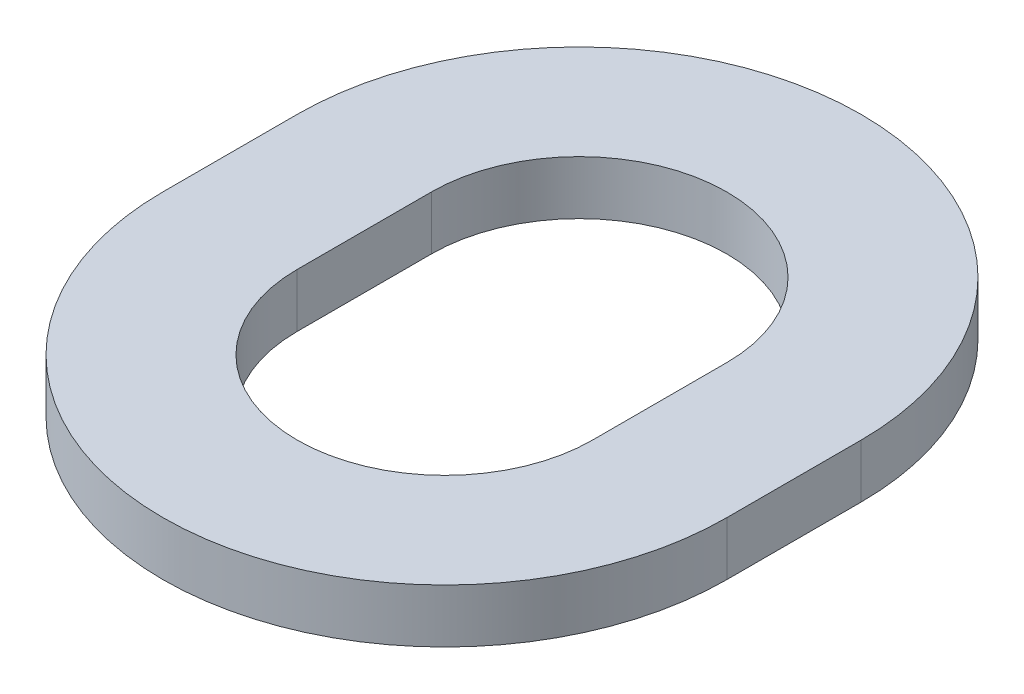
ISO-10303-21;
HEADER;
FILE_DESCRIPTION(('STEP AP214'),'2;1');
FILE_NAME('part.step','',(''),(''),'','','');
FILE_SCHEMA(('AUTOMOTIVE_DESIGN { 1 0 10303 214 1 1 1 1 }'));
ENDSEC;
DATA;
#1=APPLICATION_CONTEXT('core data for automotive mechanical design processes');
#2=APPLICATION_PROTOCOL_DEFINITION('international standard','automotive_design',2000,#1);
#3=PRODUCT_CONTEXT('',#1,'mechanical');
#4=PRODUCT('Part','Part','',(#3));
#5=PRODUCT_RELATED_PRODUCT_CATEGORY('part','',(#4));
#6=PRODUCT_DEFINITION_FORMATION('','',#4);
#7=PRODUCT_DEFINITION_CONTEXT('part definition',#1,'design');
#8=PRODUCT_DEFINITION('design','',#6,#7);
#9=PRODUCT_DEFINITION_SHAPE('','',#8);
#10=(LENGTH_UNIT() NAMED_UNIT(*) SI_UNIT(.MILLI.,.METRE.));
#11=(NAMED_UNIT(*) PLANE_ANGLE_UNIT() SI_UNIT($,.RADIAN.));
#12=(NAMED_UNIT(*) SI_UNIT($,.STERADIAN.) SOLID_ANGLE_UNIT());
#13=UNCERTAINTY_MEASURE_WITH_UNIT(LENGTH_MEASURE(1.E-05),#10,'distance_accuracy_value','');
#14=(GEOMETRIC_REPRESENTATION_CONTEXT(3) GLOBAL_UNCERTAINTY_ASSIGNED_CONTEXT((#13)) GLOBAL_UNIT_ASSIGNED_CONTEXT((#10,
#11,#12)) REPRESENTATION_CONTEXT('',''));
#15=CARTESIAN_POINT('',(0.,0.,0.));
#16=DIRECTION('',(0.,0.,1.));
#17=DIRECTION('',(1.,0.,0.));
#18=AXIS2_PLACEMENT_3D('',#15,#16,#17);
#19=CARTESIAN_POINT('',(0.,4.,0.));
#20=DIRECTION('',(0.,1.,0.));
#21=DIRECTION('',(0.,0.,1.));
#22=AXIS2_PLACEMENT_3D('',#19,#20,#21);
#23=PLANE('',#22);
#24=CARTESIAN_POINT('',(0.,4.,0.));
#25=DIRECTION('',(0.,1.,0.));
#26=DIRECTION('',(0.,0.,1.));
#27=AXIS2_PLACEMENT_3D('',#24,#25,#26);
#28=CIRCLE('',#27,21.);
#29=CARTESIAN_POINT('',(21.,4.,0.));
#30=VERTEX_POINT('',#29);
#31=CARTESIAN_POINT('',(-21.,4.,0.));
#32=VERTEX_POINT('',#31);
#33=EDGE_CURVE('E136',#30,#32,#28,.T.);
#34=ORIENTED_EDGE('',*,*,#33,.T.);
#35=DIRECTION('',(0.,0.,1.));
#36=VECTOR('',#35,1.);
#37=CARTESIAN_POINT('',(-21.,4.,0.));
#38=LINE('',#37,#36);
#39=CARTESIAN_POINT('',(-21.,4.,10.));
#40=VERTEX_POINT('',#39);
#41=EDGE_CURVE('E139',#32,#40,#38,.T.);
#42=ORIENTED_EDGE('',*,*,#41,.T.);
#43=CARTESIAN_POINT('',(0.,4.,10.));
#44=DIRECTION('',(0.,1.,0.));
#45=DIRECTION('',(0.,0.,-1.));
#46=AXIS2_PLACEMENT_3D('',#43,#44,#45);
#47=CIRCLE('',#46,21.);
#48=CARTESIAN_POINT('',(21.,4.,10.));
#49=VERTEX_POINT('',#48);
#50=EDGE_CURVE('E142',#40,#49,#47,.T.);
#51=ORIENTED_EDGE('',*,*,#50,.T.);
#52=DIRECTION('',(0.,0.,-1.));
#53=VECTOR('',#52,1.);
#54=CARTESIAN_POINT('',(21.,4.,0.));
#55=LINE('',#54,#53);
#56=EDGE_CURVE('E144',#49,#30,#55,.T.);
#57=ORIENTED_EDGE('',*,*,#56,.T.);
#58=EDGE_LOOP('',(#34,#42,#51,#57));
#59=FACE_BOUND('',#58,.T.);
#60=DIRECTION('',(0.,0.,1.));
#61=VECTOR('',#60,1.);
#62=CARTESIAN_POINT('',(-11.,4.,0.));
#63=LINE('',#62,#61);
#64=CARTESIAN_POINT('',(-11.,4.,0.));
#65=VERTEX_POINT('',#64);
#66=CARTESIAN_POINT('',(-11.,4.,10.));
#67=VERTEX_POINT('',#66);
#68=EDGE_CURVE('E108',#65,#67,#63,.T.);
#69=ORIENTED_EDGE('',*,*,#68,.F.);
#70=CARTESIAN_POINT('',(0.,4.,0.));
#71=DIRECTION('',(0.,1.,0.));
#72=DIRECTION('',(0.,0.,1.));
#73=AXIS2_PLACEMENT_3D('',#70,#71,#72);
#74=CIRCLE('',#73,11.);
#75=CARTESIAN_POINT('',(11.,4.,0.));
#76=VERTEX_POINT('',#75);
#77=EDGE_CURVE('E100',#76,#65,#74,.T.);
#78=ORIENTED_EDGE('',*,*,#77,.F.);
#79=DIRECTION('',(0.,0.,-1.));
#80=VECTOR('',#79,1.);
#81=CARTESIAN_POINT('',(11.,4.,0.));
#82=LINE('',#81,#80);
#83=CARTESIAN_POINT('',(11.,4.,10.));
#84=VERTEX_POINT('',#83);
#85=EDGE_CURVE('E122',#84,#76,#82,.T.);
#86=ORIENTED_EDGE('',*,*,#85,.F.);
#87=CARTESIAN_POINT('',(0.,4.,10.));
#88=DIRECTION('',(0.,1.,0.));
#89=DIRECTION('',(0.,0.,-1.));
#90=AXIS2_PLACEMENT_3D('',#87,#88,#89);
#91=CIRCLE('',#90,11.);
#92=EDGE_CURVE('E120',#67,#84,#91,.T.);
#93=ORIENTED_EDGE('',*,*,#92,.F.);
#94=EDGE_LOOP('',(#69,#78,#86,#93));
#95=FACE_BOUND('',#94,.T.);
#96=ADVANCED_FACE('F35',(#59,#95),#23,.T.);
#97=CARTESIAN_POINT('',(0.,0.,0.));
#98=DIRECTION('',(0.,1.,0.));
#99=DIRECTION('',(0.,0.,1.));
#100=AXIS2_PLACEMENT_3D('',#97,#98,#99);
#101=PLANE('',#100);
#102=CARTESIAN_POINT('',(0.,0.,0.));
#103=DIRECTION('',(0.,1.,0.));
#104=DIRECTION('',(0.,0.,1.));
#105=AXIS2_PLACEMENT_3D('',#102,#103,#104);
#106=CIRCLE('',#105,21.);
#107=CARTESIAN_POINT('',(21.,0.,0.));
#108=VERTEX_POINT('',#107);
#109=CARTESIAN_POINT('',(-21.,0.,0.));
#110=VERTEX_POINT('',#109);
#111=EDGE_CURVE('E116',#108,#110,#106,.T.);
#112=ORIENTED_EDGE('',*,*,#111,.F.);
#113=DIRECTION('',(0.,0.,-1.));
#114=VECTOR('',#113,1.);
#115=CARTESIAN_POINT('',(21.,0.,0.));
#116=LINE('',#115,#114);
#117=CARTESIAN_POINT('',(21.,0.,10.));
#118=VERTEX_POINT('',#117);
#119=EDGE_CURVE('E140',#118,#108,#116,.T.);
#120=ORIENTED_EDGE('',*,*,#119,.F.);
#121=CARTESIAN_POINT('',(0.,0.,10.));
#122=DIRECTION('',(0.,1.,0.));
#123=DIRECTION('',(0.,0.,-1.));
#124=AXIS2_PLACEMENT_3D('',#121,#122,#123);
#125=CIRCLE('',#124,21.);
#126=CARTESIAN_POINT('',(-21.,0.,10.));
#127=VERTEX_POINT('',#126);
#128=EDGE_CURVE('E151',#127,#118,#125,.T.);
#129=ORIENTED_EDGE('',*,*,#128,.F.);
#130=DIRECTION('',(0.,0.,1.));
#131=VECTOR('',#130,1.);
#132=CARTESIAN_POINT('',(-21.,0.,0.));
#133=LINE('',#132,#131);
#134=EDGE_CURVE('E149',#110,#127,#133,.T.);
#135=ORIENTED_EDGE('',*,*,#134,.F.);
#136=EDGE_LOOP('',(#112,#120,#129,#135));
#137=FACE_BOUND('',#136,.T.);
#138=CARTESIAN_POINT('',(0.,0.,0.));
#139=DIRECTION('',(0.,1.,0.));
#140=DIRECTION('',(0.,0.,1.));
#141=AXIS2_PLACEMENT_3D('',#138,#139,#140);
#142=CIRCLE('',#141,11.);
#143=CARTESIAN_POINT('',(11.,0.,0.));
#144=VERTEX_POINT('',#143);
#145=CARTESIAN_POINT('',(-11.,0.,0.));
#146=VERTEX_POINT('',#145);
#147=EDGE_CURVE('E58',#144,#146,#142,.T.);
#148=ORIENTED_EDGE('',*,*,#147,.T.);
#149=DIRECTION('',(0.,0.,1.));
#150=VECTOR('',#149,1.);
#151=CARTESIAN_POINT('',(-11.,0.,0.));
#152=LINE('',#151,#150);
#153=CARTESIAN_POINT('',(-11.,0.,10.));
#154=VERTEX_POINT('',#153);
#155=EDGE_CURVE('E115',#146,#154,#152,.T.);
#156=ORIENTED_EDGE('',*,*,#155,.T.);
#157=CARTESIAN_POINT('',(0.,0.,10.));
#158=DIRECTION('',(0.,1.,0.));
#159=DIRECTION('',(0.,0.,-1.));
#160=AXIS2_PLACEMENT_3D('',#157,#158,#159);
#161=CIRCLE('',#160,11.);
#162=CARTESIAN_POINT('',(11.,0.,10.));
#163=VERTEX_POINT('',#162);
#164=EDGE_CURVE('E128',#154,#163,#161,.T.);
#165=ORIENTED_EDGE('',*,*,#164,.T.);
#166=DIRECTION('',(0.,0.,-1.));
#167=VECTOR('',#166,1.);
#168=CARTESIAN_POINT('',(11.,0.,0.));
#169=LINE('',#168,#167);
#170=EDGE_CURVE('E109',#163,#144,#169,.T.);
#171=ORIENTED_EDGE('',*,*,#170,.T.);
#172=EDGE_LOOP('',(#148,#156,#165,#171));
#173=FACE_BOUND('',#172,.T.);
#174=ADVANCED_FACE('F169',(#137,#173),#101,.F.);
#175=CARTESIAN_POINT('',(0.,4.,0.));
#176=DIRECTION('',(0.,-1.,0.));
#177=DIRECTION('',(0.,0.,-1.));
#178=AXIS2_PLACEMENT_3D('',#175,#176,#177);
#179=CYLINDRICAL_SURFACE('',#178,21.);
#180=ORIENTED_EDGE('',*,*,#111,.T.);
#181=DIRECTION('',(0.,-1.,0.));
#182=VECTOR('',#181,1.);
#183=CARTESIAN_POINT('',(-21.,4.,0.));
#184=LINE('',#183,#182);
#185=EDGE_CURVE('E11',#32,#110,#184,.T.);
#186=ORIENTED_EDGE('',*,*,#185,.F.);
#187=ORIENTED_EDGE('',*,*,#33,.F.);
#188=DIRECTION('',(0.,-1.,0.));
#189=VECTOR('',#188,1.);
#190=CARTESIAN_POINT('',(21.,4.,0.));
#191=LINE('',#190,#189);
#192=EDGE_CURVE('E146',#30,#108,#191,.T.);
#193=ORIENTED_EDGE('',*,*,#192,.T.);
#194=EDGE_LOOP('',(#180,#186,#187,#193));
#195=FACE_BOUND('',#194,.T.);
#196=ADVANCED_FACE('F37',(#195),#179,.T.);
#197=CARTESIAN_POINT('',(-21.,4.,0.));
#198=DIRECTION('',(1.,0.,0.));
#199=DIRECTION('',(0.,0.,-1.));
#200=AXIS2_PLACEMENT_3D('',#197,#198,#199);
#201=PLANE('',#200);
#202=ORIENTED_EDGE('',*,*,#134,.T.);
#203=DIRECTION('',(0.,-1.,0.));
#204=VECTOR('',#203,1.);
#205=CARTESIAN_POINT('',(-21.,4.,10.));
#206=LINE('',#205,#204);
#207=EDGE_CURVE('E43',#40,#127,#206,.T.);
#208=ORIENTED_EDGE('',*,*,#207,.F.);
#209=ORIENTED_EDGE('',*,*,#41,.F.);
#210=ORIENTED_EDGE('',*,*,#185,.T.);
#211=EDGE_LOOP('',(#202,#208,#209,#210));
#212=FACE_BOUND('',#211,.T.);
#213=ADVANCED_FACE('F179',(#212),#201,.F.);
#214=CARTESIAN_POINT('',(0.,4.,10.));
#215=DIRECTION('',(0.,-1.,0.));
#216=DIRECTION('',(0.,0.,-1.));
#217=AXIS2_PLACEMENT_3D('',#214,#215,#216);
#218=CYLINDRICAL_SURFACE('',#217,21.);
#219=ORIENTED_EDGE('',*,*,#128,.T.);
#220=DIRECTION('',(0.,-1.,0.));
#221=VECTOR('',#220,1.);
#222=CARTESIAN_POINT('',(21.,4.,10.));
#223=LINE('',#222,#221);
#224=EDGE_CURVE('E156',#49,#118,#223,.T.);
#225=ORIENTED_EDGE('',*,*,#224,.F.);
#226=ORIENTED_EDGE('',*,*,#50,.F.);
#227=ORIENTED_EDGE('',*,*,#207,.T.);
#228=EDGE_LOOP('',(#219,#225,#226,#227));
#229=FACE_BOUND('',#228,.T.);
#230=ADVANCED_FACE('F163',(#229),#218,.T.);
#231=CARTESIAN_POINT('',(21.,4.,0.));
#232=DIRECTION('',(-1.,0.,0.));
#233=DIRECTION('',(0.,0.,1.));
#234=AXIS2_PLACEMENT_3D('',#231,#232,#233);
#235=PLANE('',#234);
#236=ORIENTED_EDGE('',*,*,#119,.T.);
#237=ORIENTED_EDGE('',*,*,#192,.F.);
#238=ORIENTED_EDGE('',*,*,#56,.F.);
#239=ORIENTED_EDGE('',*,*,#224,.T.);
#240=EDGE_LOOP('',(#236,#237,#238,#239));
#241=FACE_BOUND('',#240,.T.);
#242=ADVANCED_FACE('F173',(#241),#235,.F.);
#243=CARTESIAN_POINT('',(0.,4.,0.));
#244=DIRECTION('',(0.,-1.,0.));
#245=DIRECTION('',(0.,0.,-1.));
#246=AXIS2_PLACEMENT_3D('',#243,#244,#245);
#247=CYLINDRICAL_SURFACE('',#246,11.);
#248=ORIENTED_EDGE('',*,*,#147,.F.);
#249=DIRECTION('',(0.,-1.,0.));
#250=VECTOR('',#249,1.);
#251=CARTESIAN_POINT('',(11.,4.,0.));
#252=LINE('',#251,#250);
#253=EDGE_CURVE('E104',#76,#144,#252,.T.);
#254=ORIENTED_EDGE('',*,*,#253,.F.);
#255=ORIENTED_EDGE('',*,*,#77,.T.);
#256=DIRECTION('',(0.,-1.,0.));
#257=VECTOR('',#256,1.);
#258=CARTESIAN_POINT('',(-11.,4.,0.));
#259=LINE('',#258,#257);
#260=EDGE_CURVE('E103',#65,#146,#259,.T.);
#261=ORIENTED_EDGE('',*,*,#260,.T.);
#262=EDGE_LOOP('',(#248,#254,#255,#261));
#263=FACE_BOUND('',#262,.T.);
#264=ADVANCED_FACE('F102',(#263),#247,.F.);
#265=CARTESIAN_POINT('',(-11.,4.,0.));
#266=DIRECTION('',(1.,0.,0.));
#267=DIRECTION('',(0.,0.,-1.));
#268=AXIS2_PLACEMENT_3D('',#265,#266,#267);
#269=PLANE('',#268);
#270=ORIENTED_EDGE('',*,*,#155,.F.);
#271=ORIENTED_EDGE('',*,*,#260,.F.);
#272=ORIENTED_EDGE('',*,*,#68,.T.);
#273=DIRECTION('',(0.,-1.,0.));
#274=VECTOR('',#273,1.);
#275=CARTESIAN_POINT('',(-11.,4.,10.));
#276=LINE('',#275,#274);
#277=EDGE_CURVE('E117',#67,#154,#276,.T.);
#278=ORIENTED_EDGE('',*,*,#277,.T.);
#279=EDGE_LOOP('',(#270,#271,#272,#278));
#280=FACE_BOUND('',#279,.T.);
#281=ADVANCED_FACE('F112',(#280),#269,.T.);
#282=CARTESIAN_POINT('',(0.,4.,10.));
#283=DIRECTION('',(0.,-1.,0.));
#284=DIRECTION('',(0.,0.,-1.));
#285=AXIS2_PLACEMENT_3D('',#282,#283,#284);
#286=CYLINDRICAL_SURFACE('',#285,11.);
#287=ORIENTED_EDGE('',*,*,#164,.F.);
#288=ORIENTED_EDGE('',*,*,#277,.F.);
#289=ORIENTED_EDGE('',*,*,#92,.T.);
#290=DIRECTION('',(0.,-1.,0.));
#291=VECTOR('',#290,1.);
#292=CARTESIAN_POINT('',(11.,4.,10.));
#293=LINE('',#292,#291);
#294=EDGE_CURVE('E50',#84,#163,#293,.T.);
#295=ORIENTED_EDGE('',*,*,#294,.T.);
#296=EDGE_LOOP('',(#287,#288,#289,#295));
#297=FACE_BOUND('',#296,.T.);
#298=ADVANCED_FACE('F202',(#297),#286,.F.);
#299=CARTESIAN_POINT('',(11.,4.,0.));
#300=DIRECTION('',(-1.,0.,0.));
#301=DIRECTION('',(0.,0.,1.));
#302=AXIS2_PLACEMENT_3D('',#299,#300,#301);
#303=PLANE('',#302);
#304=ORIENTED_EDGE('',*,*,#170,.F.);
#305=ORIENTED_EDGE('',*,*,#294,.F.);
#306=ORIENTED_EDGE('',*,*,#85,.T.);
#307=ORIENTED_EDGE('',*,*,#253,.T.);
#308=EDGE_LOOP('',(#304,#305,#306,#307));
#309=FACE_BOUND('',#308,.T.);
#310=ADVANCED_FACE('F206',(#309),#303,.T.);
#311=CLOSED_SHELL('',(#96,#174,#196,#213,#230,#242,#264,#281,#298,#310));
#312=MANIFOLD_SOLID_BREP('B2',#311);
#313=ADVANCED_BREP_SHAPE_REPRESENTATION('',(#18,#312),#14);
#314=SHAPE_DEFINITION_REPRESENTATION(#9,#313);
ENDSEC;
END-ISO-10303-21;
